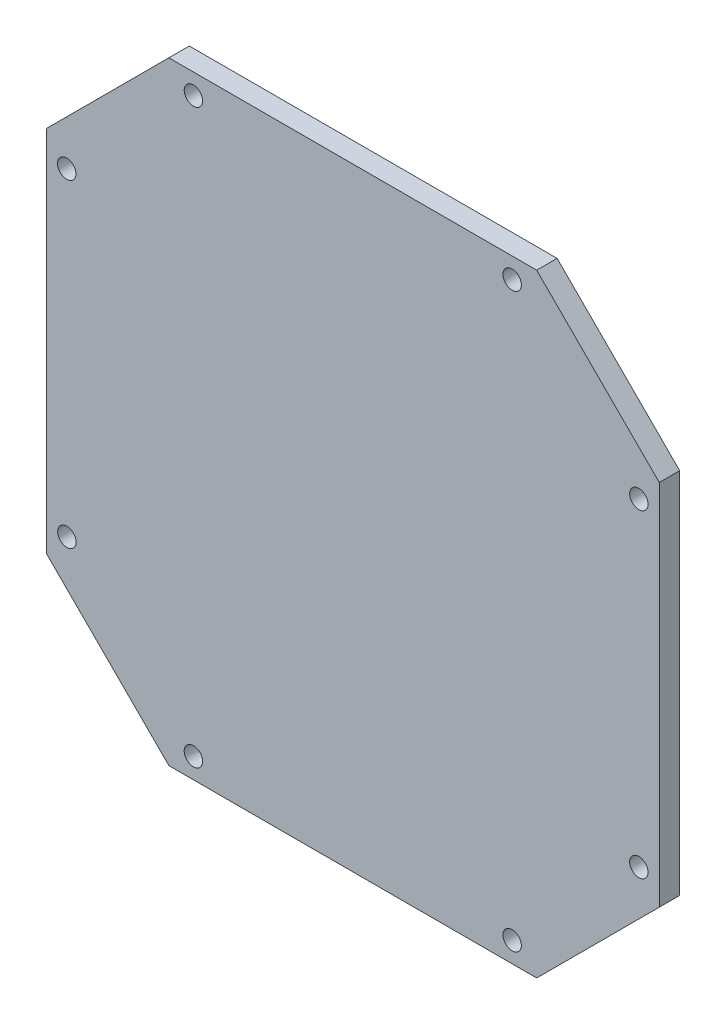
ISO-10303-21;
HEADER;
FILE_DESCRIPTION(('STEP AP214'),'2;1');
FILE_NAME('part.step','',(''),(''),'','','');
FILE_SCHEMA(('AUTOMOTIVE_DESIGN { 1 0 10303 214 1 1 1 1 }'));
ENDSEC;
DATA;
#1=APPLICATION_CONTEXT('core data for automotive mechanical design processes');
#2=APPLICATION_PROTOCOL_DEFINITION('international standard','automotive_design',2000,#1);
#3=PRODUCT_CONTEXT('',#1,'mechanical');
#4=PRODUCT('Part','Part','',(#3));
#5=PRODUCT_RELATED_PRODUCT_CATEGORY('part','',(#4));
#6=PRODUCT_DEFINITION_FORMATION('','',#4);
#7=PRODUCT_DEFINITION_CONTEXT('part definition',#1,'design');
#8=PRODUCT_DEFINITION('design','',#6,#7);
#9=PRODUCT_DEFINITION_SHAPE('','',#8);
#10=(LENGTH_UNIT() NAMED_UNIT(*) SI_UNIT(.MILLI.,.METRE.));
#11=(NAMED_UNIT(*) PLANE_ANGLE_UNIT() SI_UNIT($,.RADIAN.));
#12=(NAMED_UNIT(*) SI_UNIT($,.STERADIAN.) SOLID_ANGLE_UNIT());
#13=UNCERTAINTY_MEASURE_WITH_UNIT(LENGTH_MEASURE(1.E-05),#10,'distance_accuracy_value','');
#14=(GEOMETRIC_REPRESENTATION_CONTEXT(3) GLOBAL_UNCERTAINTY_ASSIGNED_CONTEXT((#13)) GLOBAL_UNIT_ASSIGNED_CONTEXT((#10,
#11,#12)) REPRESENTATION_CONTEXT('',''));
#15=CARTESIAN_POINT('',(0.,0.,0.));
#16=DIRECTION('',(0.,0.,1.));
#17=DIRECTION('',(1.,0.,0.));
#18=AXIS2_PLACEMENT_3D('',#15,#16,#17);
#19=CARTESIAN_POINT('',(60.,-60.0000000000002,10.));
#20=DIRECTION('',(0.707106781186549,0.707106781186547,0.));
#21=DIRECTION('',(-0.707106781186547,0.707106781186549,0.));
#22=AXIS2_PLACEMENT_3D('',#19,#20,#21);
#23=PLANE('',#22);
#24=DIRECTION('',(0.707106781186547,-0.707106781186549,0.));
#25=VECTOR('',#24,1.);
#26=CARTESIAN_POINT('',(60.,-60.0000000000002,0.));
#27=LINE('',#26,#25);
#28=CARTESIAN_POINT('',(0.,0.,0.));
#29=VERTEX_POINT('',#28);
#30=CARTESIAN_POINT('',(60.,-60.0000000000002,0.));
#31=VERTEX_POINT('',#30);
#32=EDGE_CURVE('E140',#29,#31,#27,.T.);
#33=ORIENTED_EDGE('',*,*,#32,.T.);
#34=DIRECTION('',(0.,0.,-1.));
#35=VECTOR('',#34,1.);
#36=CARTESIAN_POINT('',(60.,-60.0000000000002,10.));
#37=LINE('',#36,#35);
#38=CARTESIAN_POINT('',(60.,-60.0000000000002,10.));
#39=VERTEX_POINT('',#38);
#40=EDGE_CURVE('E11',#39,#31,#37,.T.);
#41=ORIENTED_EDGE('',*,*,#40,.F.);
#42=DIRECTION('',(0.707106781186547,-0.707106781186549,0.));
#43=VECTOR('',#42,1.);
#44=CARTESIAN_POINT('',(60.,-60.0000000000002,10.));
#45=LINE('',#44,#43);
#46=CARTESIAN_POINT('',(0.,0.,10.));
#47=VERTEX_POINT('',#46);
#48=EDGE_CURVE('E155',#47,#39,#45,.T.);
#49=ORIENTED_EDGE('',*,*,#48,.F.);
#50=DIRECTION('',(0.,0.,-1.));
#51=VECTOR('',#50,1.);
#52=CARTESIAN_POINT('',(0.,0.,10.));
#53=LINE('',#52,#51);
#54=EDGE_CURVE('E133',#47,#29,#53,.T.);
#55=ORIENTED_EDGE('',*,*,#54,.T.);
#56=EDGE_LOOP('',(#33,#41,#49,#55));
#57=FACE_BOUND('',#56,.T.);
#58=ADVANCED_FACE('F41',(#57),#23,.F.);
#59=CARTESIAN_POINT('',(240.,-60.0000000000001,10.));
#60=DIRECTION('',(0.,1.,0.));
#61=DIRECTION('',(-1.,0.,0.));
#62=AXIS2_PLACEMENT_3D('',#59,#60,#61);
#63=PLANE('',#62);
#64=DIRECTION('',(1.,0.,0.));
#65=VECTOR('',#64,1.);
#66=CARTESIAN_POINT('',(240.,-60.0000000000001,0.));
#67=LINE('',#66,#65);
#68=CARTESIAN_POINT('',(240.,-60.0000000000001,0.));
#69=VERTEX_POINT('',#68);
#70=EDGE_CURVE('E139',#31,#69,#67,.T.);
#71=ORIENTED_EDGE('',*,*,#70,.T.);
#72=DIRECTION('',(0.,0.,-1.));
#73=VECTOR('',#72,1.);
#74=CARTESIAN_POINT('',(240.,-60.0000000000001,10.));
#75=LINE('',#74,#73);
#76=CARTESIAN_POINT('',(240.,-60.0000000000001,10.));
#77=VERTEX_POINT('',#76);
#78=EDGE_CURVE('E47',#77,#69,#75,.T.);
#79=ORIENTED_EDGE('',*,*,#78,.F.);
#80=DIRECTION('',(1.,0.,0.));
#81=VECTOR('',#80,1.);
#82=CARTESIAN_POINT('',(240.,-60.0000000000001,10.));
#83=LINE('',#82,#81);
#84=EDGE_CURVE('E99',#39,#77,#83,.T.);
#85=ORIENTED_EDGE('',*,*,#84,.F.);
#86=ORIENTED_EDGE('',*,*,#40,.T.);
#87=EDGE_LOOP('',(#71,#79,#85,#86));
#88=FACE_BOUND('',#87,.T.);
#89=ADVANCED_FACE('F269',(#88),#63,.F.);
#90=CARTESIAN_POINT('',(300.,0.,10.));
#91=DIRECTION('',(-0.707106781186549,0.707106781186546,0.));
#92=DIRECTION('',(-0.707106781186546,-0.707106781186549,0.));
#93=AXIS2_PLACEMENT_3D('',#90,#91,#92);
#94=PLANE('',#93);
#95=DIRECTION('',(0.707106781186546,0.707106781186549,0.));
#96=VECTOR('',#95,1.);
#97=CARTESIAN_POINT('',(300.,0.,0.));
#98=LINE('',#97,#96);
#99=CARTESIAN_POINT('',(300.,0.,0.));
#100=VERTEX_POINT('',#99);
#101=EDGE_CURVE('E142',#69,#100,#98,.T.);
#102=ORIENTED_EDGE('',*,*,#101,.T.);
#103=DIRECTION('',(0.,0.,-1.));
#104=VECTOR('',#103,1.);
#105=CARTESIAN_POINT('',(300.,0.,10.));
#106=LINE('',#105,#104);
#107=CARTESIAN_POINT('',(300.,0.,10.));
#108=VERTEX_POINT('',#107);
#109=EDGE_CURVE('E159',#108,#100,#106,.T.);
#110=ORIENTED_EDGE('',*,*,#109,.F.);
#111=DIRECTION('',(0.707106781186546,0.707106781186549,0.));
#112=VECTOR('',#111,1.);
#113=CARTESIAN_POINT('',(300.,0.,10.));
#114=LINE('',#113,#112);
#115=EDGE_CURVE('E167',#77,#108,#114,.T.);
#116=ORIENTED_EDGE('',*,*,#115,.F.);
#117=ORIENTED_EDGE('',*,*,#78,.T.);
#118=EDGE_LOOP('',(#102,#110,#116,#117));
#119=FACE_BOUND('',#118,.T.);
#120=ADVANCED_FACE('F164',(#119),#94,.F.);
#121=CARTESIAN_POINT('',(300.,179.999999999999,10.));
#122=DIRECTION('',(-1.,0.,0.));
#123=DIRECTION('',(0.,-1.,0.));
#124=AXIS2_PLACEMENT_3D('',#121,#122,#123);
#125=PLANE('',#124);
#126=DIRECTION('',(0.,1.,0.));
#127=VECTOR('',#126,1.);
#128=CARTESIAN_POINT('',(300.,179.999999999999,0.));
#129=LINE('',#128,#127);
#130=CARTESIAN_POINT('',(300.,179.999999999999,0.));
#131=VERTEX_POINT('',#130);
#132=EDGE_CURVE('E144',#100,#131,#129,.T.);
#133=ORIENTED_EDGE('',*,*,#132,.T.);
#134=DIRECTION('',(0.,0.,-1.));
#135=VECTOR('',#134,1.);
#136=CARTESIAN_POINT('',(300.,179.999999999999,10.));
#137=LINE('',#136,#135);
#138=CARTESIAN_POINT('',(300.,179.999999999999,10.));
#139=VERTEX_POINT('',#138);
#140=EDGE_CURVE('E157',#139,#131,#137,.T.);
#141=ORIENTED_EDGE('',*,*,#140,.F.);
#142=DIRECTION('',(0.,1.,0.));
#143=VECTOR('',#142,1.);
#144=CARTESIAN_POINT('',(300.,179.999999999999,10.));
#145=LINE('',#144,#143);
#146=EDGE_CURVE('E177',#108,#139,#145,.T.);
#147=ORIENTED_EDGE('',*,*,#146,.F.);
#148=ORIENTED_EDGE('',*,*,#109,.T.);
#149=EDGE_LOOP('',(#133,#141,#147,#148));
#150=FACE_BOUND('',#149,.T.);
#151=ADVANCED_FACE('F172',(#150),#125,.F.);
#152=CARTESIAN_POINT('',(240.,240.,10.));
#153=DIRECTION('',(-0.707106781186551,-0.707106781186544,0.));
#154=DIRECTION('',(0.707106781186544,-0.707106781186551,0.));
#155=AXIS2_PLACEMENT_3D('',#152,#153,#154);
#156=PLANE('',#155);
#157=DIRECTION('',(-0.707106781186544,0.707106781186551,0.));
#158=VECTOR('',#157,1.);
#159=CARTESIAN_POINT('',(240.,240.,0.));
#160=LINE('',#159,#158);
#161=CARTESIAN_POINT('',(240.,240.,0.));
#162=VERTEX_POINT('',#161);
#163=EDGE_CURVE('E150',#131,#162,#160,.T.);
#164=ORIENTED_EDGE('',*,*,#163,.T.);
#165=DIRECTION('',(0.,0.,-1.));
#166=VECTOR('',#165,1.);
#167=CARTESIAN_POINT('',(240.,240.,10.));
#168=LINE('',#167,#166);
#169=CARTESIAN_POINT('',(240.,240.,10.));
#170=VERTEX_POINT('',#169);
#171=EDGE_CURVE('E126',#170,#162,#168,.T.);
#172=ORIENTED_EDGE('',*,*,#171,.F.);
#173=DIRECTION('',(-0.707106781186544,0.707106781186551,0.));
#174=VECTOR('',#173,1.);
#175=CARTESIAN_POINT('',(240.,240.,10.));
#176=LINE('',#175,#174);
#177=EDGE_CURVE('E117',#139,#170,#176,.T.);
#178=ORIENTED_EDGE('',*,*,#177,.F.);
#179=ORIENTED_EDGE('',*,*,#140,.T.);
#180=EDGE_LOOP('',(#164,#172,#178,#179));
#181=FACE_BOUND('',#180,.T.);
#182=ADVANCED_FACE('F178',(#181),#156,.F.);
#183=CARTESIAN_POINT('',(60.0000000000004,240.,10.));
#184=DIRECTION('',(0.,-1.,0.));
#185=DIRECTION('',(0.,0.,-1.));
#186=AXIS2_PLACEMENT_3D('',#183,#184,#185);
#187=PLANE('',#186);
#188=DIRECTION('',(-1.,0.,0.));
#189=VECTOR('',#188,1.);
#190=CARTESIAN_POINT('',(60.0000000000004,240.,0.));
#191=LINE('',#190,#189);
#192=CARTESIAN_POINT('',(60.0000000000004,240.,0.));
#193=VERTEX_POINT('',#192);
#194=EDGE_CURVE('E130',#162,#193,#191,.T.);
#195=ORIENTED_EDGE('',*,*,#194,.T.);
#196=DIRECTION('',(0.,0.,-1.));
#197=VECTOR('',#196,1.);
#198=CARTESIAN_POINT('',(60.0000000000004,240.,10.));
#199=LINE('',#198,#197);
#200=CARTESIAN_POINT('',(60.0000000000004,240.,10.));
#201=VERTEX_POINT('',#200);
#202=EDGE_CURVE('E125',#201,#193,#199,.T.);
#203=ORIENTED_EDGE('',*,*,#202,.F.);
#204=DIRECTION('',(-1.,0.,0.));
#205=VECTOR('',#204,1.);
#206=CARTESIAN_POINT('',(60.0000000000004,240.,10.));
#207=LINE('',#206,#205);
#208=EDGE_CURVE('E111',#170,#201,#207,.T.);
#209=ORIENTED_EDGE('',*,*,#208,.F.);
#210=ORIENTED_EDGE('',*,*,#171,.T.);
#211=EDGE_LOOP('',(#195,#203,#209,#210));
#212=FACE_BOUND('',#211,.T.);
#213=ADVANCED_FACE('F124',(#212),#187,.F.);
#214=CARTESIAN_POINT('',(0.,180.,10.));
#215=DIRECTION('',(0.707106781186544,-0.707106781186551,0.));
#216=DIRECTION('',(0.707106781186551,0.707106781186544,0.));
#217=AXIS2_PLACEMENT_3D('',#214,#215,#216);
#218=PLANE('',#217);
#219=DIRECTION('',(-0.707106781186551,-0.707106781186544,0.));
#220=VECTOR('',#219,1.);
#221=CARTESIAN_POINT('',(0.,180.,0.));
#222=LINE('',#221,#220);
#223=CARTESIAN_POINT('',(0.,180.,0.));
#224=VERTEX_POINT('',#223);
#225=EDGE_CURVE('E86',#193,#224,#222,.T.);
#226=ORIENTED_EDGE('',*,*,#225,.T.);
#227=DIRECTION('',(0.,0.,-1.));
#228=VECTOR('',#227,1.);
#229=CARTESIAN_POINT('',(0.,180.,10.));
#230=LINE('',#229,#228);
#231=CARTESIAN_POINT('',(0.,180.,10.));
#232=VERTEX_POINT('',#231);
#233=EDGE_CURVE('E129',#232,#224,#230,.T.);
#234=ORIENTED_EDGE('',*,*,#233,.F.);
#235=DIRECTION('',(-0.707106781186551,-0.707106781186544,0.));
#236=VECTOR('',#235,1.);
#237=CARTESIAN_POINT('',(0.,180.,10.));
#238=LINE('',#237,#236);
#239=EDGE_CURVE('E120',#201,#232,#238,.T.);
#240=ORIENTED_EDGE('',*,*,#239,.F.);
#241=ORIENTED_EDGE('',*,*,#202,.T.);
#242=EDGE_LOOP('',(#226,#234,#240,#241));
#243=FACE_BOUND('',#242,.T.);
#244=ADVANCED_FACE('F131',(#243),#218,.F.);
#245=CARTESIAN_POINT('',(0.,0.,10.));
#246=DIRECTION('',(1.,0.,0.));
#247=DIRECTION('',(0.,0.,-1.));
#248=AXIS2_PLACEMENT_3D('',#245,#246,#247);
#249=PLANE('',#248);
#250=DIRECTION('',(0.,-1.,0.));
#251=VECTOR('',#250,1.);
#252=CARTESIAN_POINT('',(0.,0.,0.));
#253=LINE('',#252,#251);
#254=EDGE_CURVE('E95',#224,#29,#253,.T.);
#255=ORIENTED_EDGE('',*,*,#254,.T.);
#256=ORIENTED_EDGE('',*,*,#54,.F.);
#257=DIRECTION('',(0.,-1.,0.));
#258=VECTOR('',#257,1.);
#259=CARTESIAN_POINT('',(0.,0.,10.));
#260=LINE('',#259,#258);
#261=EDGE_CURVE('E60',#232,#47,#260,.T.);
#262=ORIENTED_EDGE('',*,*,#261,.F.);
#263=ORIENTED_EDGE('',*,*,#233,.T.);
#264=EDGE_LOOP('',(#255,#256,#262,#263));
#265=FACE_BOUND('',#264,.T.);
#266=ADVANCED_FACE('F263',(#265),#249,.F.);
#267=CARTESIAN_POINT('',(0.,0.,10.));
#268=DIRECTION('',(0.,0.,-1.));
#269=DIRECTION('',(-1.,0.,0.));
#270=AXIS2_PLACEMENT_3D('',#267,#268,#269);
#271=PLANE('',#270);
#272=CARTESIAN_POINT('',(72.,230.,10.));
#273=DIRECTION('',(0.,0.,-1.));
#274=DIRECTION('',(-1.,0.,0.));
#275=AXIS2_PLACEMENT_3D('',#272,#273,#274);
#276=CIRCLE('',#275,4.5);
#277=CARTESIAN_POINT('',(67.5,230.,10.));
#278=VERTEX_POINT('',#277);
#279=EDGE_CURVE('E226',#278,#278,#276,.T.);
#280=ORIENTED_EDGE('',*,*,#279,.T.);
#281=EDGE_LOOP('',(#280));
#282=FACE_BOUND('',#281,.T.);
#283=CARTESIAN_POINT('',(228.,230.,10.));
#284=DIRECTION('',(0.,0.,-1.));
#285=DIRECTION('',(-1.,0.,0.));
#286=AXIS2_PLACEMENT_3D('',#283,#284,#285);
#287=CIRCLE('',#286,4.5);
#288=CARTESIAN_POINT('',(223.5,230.,10.));
#289=VERTEX_POINT('',#288);
#290=EDGE_CURVE('E217',#289,#289,#287,.T.);
#291=ORIENTED_EDGE('',*,*,#290,.T.);
#292=EDGE_LOOP('',(#291));
#293=FACE_BOUND('',#292,.T.);
#294=CARTESIAN_POINT('',(290.,168.,10.));
#295=DIRECTION('',(0.,0.,-1.));
#296=DIRECTION('',(-1.,0.,0.));
#297=AXIS2_PLACEMENT_3D('',#294,#295,#296);
#298=CIRCLE('',#297,4.5);
#299=CARTESIAN_POINT('',(285.5,168.,10.));
#300=VERTEX_POINT('',#299);
#301=EDGE_CURVE('E215',#300,#300,#298,.T.);
#302=ORIENTED_EDGE('',*,*,#301,.T.);
#303=EDGE_LOOP('',(#302));
#304=FACE_BOUND('',#303,.T.);
#305=CARTESIAN_POINT('',(290.,11.9999999999998,10.));
#306=DIRECTION('',(0.,0.,-1.));
#307=DIRECTION('',(-1.,0.,0.));
#308=AXIS2_PLACEMENT_3D('',#305,#306,#307);
#309=CIRCLE('',#308,4.5);
#310=CARTESIAN_POINT('',(285.5,11.9999999999998,10.));
#311=VERTEX_POINT('',#310);
#312=EDGE_CURVE('E206',#311,#311,#309,.T.);
#313=ORIENTED_EDGE('',*,*,#312,.T.);
#314=EDGE_LOOP('',(#313));
#315=FACE_BOUND('',#314,.T.);
#316=CARTESIAN_POINT('',(228.,-50.0000000000002,10.));
#317=DIRECTION('',(0.,0.,-1.));
#318=DIRECTION('',(-1.,0.,0.));
#319=AXIS2_PLACEMENT_3D('',#316,#317,#318);
#320=CIRCLE('',#319,4.5);
#321=CARTESIAN_POINT('',(223.5,-50.0000000000002,10.));
#322=VERTEX_POINT('',#321);
#323=EDGE_CURVE('E205',#322,#322,#320,.T.);
#324=ORIENTED_EDGE('',*,*,#323,.T.);
#325=EDGE_LOOP('',(#324));
#326=FACE_BOUND('',#325,.T.);
#327=CARTESIAN_POINT('',(72.,-50.0000000000002,10.));
#328=DIRECTION('',(0.,0.,-1.));
#329=DIRECTION('',(-1.,0.,0.));
#330=AXIS2_PLACEMENT_3D('',#327,#328,#329);
#331=CIRCLE('',#330,4.5);
#332=CARTESIAN_POINT('',(67.5,-50.0000000000002,10.));
#333=VERTEX_POINT('',#332);
#334=EDGE_CURVE('E198',#333,#333,#331,.T.);
#335=ORIENTED_EDGE('',*,*,#334,.T.);
#336=EDGE_LOOP('',(#335));
#337=FACE_BOUND('',#336,.T.);
#338=CARTESIAN_POINT('',(10.0957252695612,11.9999999999998,10.));
#339=DIRECTION('',(0.,0.,-1.));
#340=DIRECTION('',(-1.,0.,0.));
#341=AXIS2_PLACEMENT_3D('',#338,#339,#340);
#342=CIRCLE('',#341,4.5);
#343=CARTESIAN_POINT('',(5.59572526956121,11.9999999999998,10.));
#344=VERTEX_POINT('',#343);
#345=EDGE_CURVE('E189',#344,#344,#342,.T.);
#346=ORIENTED_EDGE('',*,*,#345,.T.);
#347=EDGE_LOOP('',(#346));
#348=FACE_BOUND('',#347,.T.);
#349=CARTESIAN_POINT('',(10.,168.,10.));
#350=DIRECTION('',(0.,0.,-1.));
#351=DIRECTION('',(-1.,0.,0.));
#352=AXIS2_PLACEMENT_3D('',#349,#350,#351);
#353=CIRCLE('',#352,4.5);
#354=CARTESIAN_POINT('',(5.50000000000001,168.,10.));
#355=VERTEX_POINT('',#354);
#356=EDGE_CURVE('E141',#355,#355,#353,.T.);
#357=ORIENTED_EDGE('',*,*,#356,.T.);
#358=EDGE_LOOP('',(#357));
#359=FACE_BOUND('',#358,.T.);
#360=ORIENTED_EDGE('',*,*,#48,.T.);
#361=ORIENTED_EDGE('',*,*,#84,.T.);
#362=ORIENTED_EDGE('',*,*,#115,.T.);
#363=ORIENTED_EDGE('',*,*,#146,.T.);
#364=ORIENTED_EDGE('',*,*,#177,.T.);
#365=ORIENTED_EDGE('',*,*,#208,.T.);
#366=ORIENTED_EDGE('',*,*,#239,.T.);
#367=ORIENTED_EDGE('',*,*,#261,.T.);
#368=EDGE_LOOP('',(#360,#361,#362,#363,#364,#365,#366,#367));
#369=FACE_BOUND('',#368,.T.);
#370=ADVANCED_FACE('F113',(#282,#293,#304,#315,#326,#337,#348,#359,#369),#271,.F.);
#371=CARTESIAN_POINT('',(0.,0.,0.));
#372=DIRECTION('',(0.,0.,-1.));
#373=DIRECTION('',(-1.,0.,0.));
#374=AXIS2_PLACEMENT_3D('',#371,#372,#373);
#375=PLANE('',#374);
#376=CARTESIAN_POINT('',(72.,230.,0.));
#377=DIRECTION('',(0.,0.,-1.));
#378=DIRECTION('',(-1.,0.,0.));
#379=AXIS2_PLACEMENT_3D('',#376,#377,#378);
#380=CIRCLE('',#379,4.5);
#381=CARTESIAN_POINT('',(67.5,230.,0.));
#382=VERTEX_POINT('',#381);
#383=EDGE_CURVE('E227',#382,#382,#380,.T.);
#384=ORIENTED_EDGE('',*,*,#383,.F.);
#385=EDGE_LOOP('',(#384));
#386=FACE_BOUND('',#385,.T.);
#387=CARTESIAN_POINT('',(228.,230.,0.));
#388=DIRECTION('',(0.,0.,-1.));
#389=DIRECTION('',(-1.,0.,0.));
#390=AXIS2_PLACEMENT_3D('',#387,#388,#389);
#391=CIRCLE('',#390,4.5);
#392=CARTESIAN_POINT('',(223.5,230.,0.));
#393=VERTEX_POINT('',#392);
#394=EDGE_CURVE('E223',#393,#393,#391,.T.);
#395=ORIENTED_EDGE('',*,*,#394,.F.);
#396=EDGE_LOOP('',(#395));
#397=FACE_BOUND('',#396,.T.);
#398=CARTESIAN_POINT('',(290.,168.,0.));
#399=DIRECTION('',(0.,0.,-1.));
#400=DIRECTION('',(-1.,0.,0.));
#401=AXIS2_PLACEMENT_3D('',#398,#399,#400);
#402=CIRCLE('',#401,4.5);
#403=CARTESIAN_POINT('',(285.5,168.,0.));
#404=VERTEX_POINT('',#403);
#405=EDGE_CURVE('E220',#404,#404,#402,.T.);
#406=ORIENTED_EDGE('',*,*,#405,.F.);
#407=EDGE_LOOP('',(#406));
#408=FACE_BOUND('',#407,.T.);
#409=CARTESIAN_POINT('',(290.,11.9999999999998,0.));
#410=DIRECTION('',(0.,0.,-1.));
#411=DIRECTION('',(-1.,0.,0.));
#412=AXIS2_PLACEMENT_3D('',#409,#410,#411);
#413=CIRCLE('',#412,4.5);
#414=CARTESIAN_POINT('',(285.5,11.9999999999998,0.));
#415=VERTEX_POINT('',#414);
#416=EDGE_CURVE('E213',#415,#415,#413,.T.);
#417=ORIENTED_EDGE('',*,*,#416,.F.);
#418=EDGE_LOOP('',(#417));
#419=FACE_BOUND('',#418,.T.);
#420=CARTESIAN_POINT('',(228.,-50.0000000000002,0.));
#421=DIRECTION('',(0.,0.,-1.));
#422=DIRECTION('',(-1.,0.,0.));
#423=AXIS2_PLACEMENT_3D('',#420,#421,#422);
#424=CIRCLE('',#423,4.5);
#425=CARTESIAN_POINT('',(223.5,-50.0000000000002,0.));
#426=VERTEX_POINT('',#425);
#427=EDGE_CURVE('E203',#426,#426,#424,.T.);
#428=ORIENTED_EDGE('',*,*,#427,.F.);
#429=EDGE_LOOP('',(#428));
#430=FACE_BOUND('',#429,.T.);
#431=CARTESIAN_POINT('',(72.,-50.0000000000002,0.));
#432=DIRECTION('',(0.,0.,-1.));
#433=DIRECTION('',(-1.,0.,0.));
#434=AXIS2_PLACEMENT_3D('',#431,#432,#433);
#435=CIRCLE('',#434,4.5);
#436=CARTESIAN_POINT('',(67.5,-50.0000000000002,0.));
#437=VERTEX_POINT('',#436);
#438=EDGE_CURVE('E197',#437,#437,#435,.T.);
#439=ORIENTED_EDGE('',*,*,#438,.F.);
#440=EDGE_LOOP('',(#439));
#441=FACE_BOUND('',#440,.T.);
#442=CARTESIAN_POINT('',(10.0957252695612,11.9999999999998,0.));
#443=DIRECTION('',(0.,0.,-1.));
#444=DIRECTION('',(-1.,0.,0.));
#445=AXIS2_PLACEMENT_3D('',#442,#443,#444);
#446=CIRCLE('',#445,4.5);
#447=CARTESIAN_POINT('',(5.59572526956121,11.9999999999998,0.));
#448=VERTEX_POINT('',#447);
#449=EDGE_CURVE('E194',#448,#448,#446,.T.);
#450=ORIENTED_EDGE('',*,*,#449,.F.);
#451=EDGE_LOOP('',(#450));
#452=FACE_BOUND('',#451,.T.);
#453=CARTESIAN_POINT('',(10.,168.,0.));
#454=DIRECTION('',(0.,0.,-1.));
#455=DIRECTION('',(-1.,0.,0.));
#456=AXIS2_PLACEMENT_3D('',#453,#454,#455);
#457=CIRCLE('',#456,4.5);
#458=CARTESIAN_POINT('',(5.50000000000001,168.,0.));
#459=VERTEX_POINT('',#458);
#460=EDGE_CURVE('E190',#459,#459,#457,.T.);
#461=ORIENTED_EDGE('',*,*,#460,.F.);
#462=EDGE_LOOP('',(#461));
#463=FACE_BOUND('',#462,.T.);
#464=ORIENTED_EDGE('',*,*,#32,.F.);
#465=ORIENTED_EDGE('',*,*,#254,.F.);
#466=ORIENTED_EDGE('',*,*,#225,.F.);
#467=ORIENTED_EDGE('',*,*,#194,.F.);
#468=ORIENTED_EDGE('',*,*,#163,.F.);
#469=ORIENTED_EDGE('',*,*,#132,.F.);
#470=ORIENTED_EDGE('',*,*,#101,.F.);
#471=ORIENTED_EDGE('',*,*,#70,.F.);
#472=EDGE_LOOP('',(#464,#465,#466,#467,#468,#469,#470,#471));
#473=FACE_BOUND('',#472,.T.);
#474=ADVANCED_FACE('F173',(#386,#397,#408,#419,#430,#441,#452,#463,#473),#375,.T.);
#475=CARTESIAN_POINT('',(10.,168.,0.));
#476=DIRECTION('',(0.,0.,-1.));
#477=DIRECTION('',(-1.,0.,0.));
#478=AXIS2_PLACEMENT_3D('',#475,#476,#477);
#479=CYLINDRICAL_SURFACE('',#478,4.5);
#480=ORIENTED_EDGE('',*,*,#460,.T.);
#481=EDGE_LOOP('',(#480));
#482=FACE_BOUND('',#481,.T.);
#483=ORIENTED_EDGE('',*,*,#356,.F.);
#484=EDGE_LOOP('',(#483));
#485=FACE_BOUND('',#484,.T.);
#486=ADVANCED_FACE('F239',(#482,#485),#479,.F.);
#487=CARTESIAN_POINT('',(10.0957252695612,11.9999999999998,0.));
#488=DIRECTION('',(0.,0.,-1.));
#489=DIRECTION('',(-1.,0.,0.));
#490=AXIS2_PLACEMENT_3D('',#487,#488,#489);
#491=CYLINDRICAL_SURFACE('',#490,4.5);
#492=ORIENTED_EDGE('',*,*,#449,.T.);
#493=EDGE_LOOP('',(#492));
#494=FACE_BOUND('',#493,.T.);
#495=ORIENTED_EDGE('',*,*,#345,.F.);
#496=EDGE_LOOP('',(#495));
#497=FACE_BOUND('',#496,.T.);
#498=ADVANCED_FACE('F258',(#494,#497),#491,.F.);
#499=CARTESIAN_POINT('',(72.,-50.0000000000002,0.));
#500=DIRECTION('',(0.,0.,-1.));
#501=DIRECTION('',(-1.,0.,0.));
#502=AXIS2_PLACEMENT_3D('',#499,#500,#501);
#503=CYLINDRICAL_SURFACE('',#502,4.5);
#504=ORIENTED_EDGE('',*,*,#438,.T.);
#505=EDGE_LOOP('',(#504));
#506=FACE_BOUND('',#505,.T.);
#507=ORIENTED_EDGE('',*,*,#334,.F.);
#508=EDGE_LOOP('',(#507));
#509=FACE_BOUND('',#508,.T.);
#510=ADVANCED_FACE('F323',(#506,#509),#503,.F.);
#511=CARTESIAN_POINT('',(228.,-50.0000000000002,0.));
#512=DIRECTION('',(0.,0.,-1.));
#513=DIRECTION('',(-1.,0.,0.));
#514=AXIS2_PLACEMENT_3D('',#511,#512,#513);
#515=CYLINDRICAL_SURFACE('',#514,4.5);
#516=ORIENTED_EDGE('',*,*,#427,.T.);
#517=EDGE_LOOP('',(#516));
#518=FACE_BOUND('',#517,.T.);
#519=ORIENTED_EDGE('',*,*,#323,.F.);
#520=EDGE_LOOP('',(#519));
#521=FACE_BOUND('',#520,.T.);
#522=ADVANCED_FACE('F332',(#518,#521),#515,.F.);
#523=CARTESIAN_POINT('',(290.,11.9999999999998,0.));
#524=DIRECTION('',(0.,0.,-1.));
#525=DIRECTION('',(-1.,0.,0.));
#526=AXIS2_PLACEMENT_3D('',#523,#524,#525);
#527=CYLINDRICAL_SURFACE('',#526,4.5);
#528=ORIENTED_EDGE('',*,*,#416,.T.);
#529=EDGE_LOOP('',(#528));
#530=FACE_BOUND('',#529,.T.);
#531=ORIENTED_EDGE('',*,*,#312,.F.);
#532=EDGE_LOOP('',(#531));
#533=FACE_BOUND('',#532,.T.);
#534=ADVANCED_FACE('F342',(#530,#533),#527,.F.);
#535=CARTESIAN_POINT('',(290.,168.,0.));
#536=DIRECTION('',(0.,0.,-1.));
#537=DIRECTION('',(-1.,0.,0.));
#538=AXIS2_PLACEMENT_3D('',#535,#536,#537);
#539=CYLINDRICAL_SURFACE('',#538,4.5);
#540=ORIENTED_EDGE('',*,*,#405,.T.);
#541=EDGE_LOOP('',(#540));
#542=FACE_BOUND('',#541,.T.);
#543=ORIENTED_EDGE('',*,*,#301,.F.);
#544=EDGE_LOOP('',(#543));
#545=FACE_BOUND('',#544,.T.);
#546=ADVANCED_FACE('F354',(#542,#545),#539,.F.);
#547=CARTESIAN_POINT('',(228.,230.,0.));
#548=DIRECTION('',(0.,0.,-1.));
#549=DIRECTION('',(-1.,0.,0.));
#550=AXIS2_PLACEMENT_3D('',#547,#548,#549);
#551=CYLINDRICAL_SURFACE('',#550,4.5);
#552=ORIENTED_EDGE('',*,*,#394,.T.);
#553=EDGE_LOOP('',(#552));
#554=FACE_BOUND('',#553,.T.);
#555=ORIENTED_EDGE('',*,*,#290,.F.);
#556=EDGE_LOOP('',(#555));
#557=FACE_BOUND('',#556,.T.);
#558=ADVANCED_FACE('F362',(#554,#557),#551,.F.);
#559=CARTESIAN_POINT('',(72.,230.,0.));
#560=DIRECTION('',(0.,0.,-1.));
#561=DIRECTION('',(-1.,0.,0.));
#562=AXIS2_PLACEMENT_3D('',#559,#560,#561);
#563=CYLINDRICAL_SURFACE('',#562,4.5);
#564=ORIENTED_EDGE('',*,*,#383,.T.);
#565=EDGE_LOOP('',(#564));
#566=FACE_BOUND('',#565,.T.);
#567=ORIENTED_EDGE('',*,*,#279,.F.);
#568=EDGE_LOOP('',(#567));
#569=FACE_BOUND('',#568,.T.);
#570=ADVANCED_FACE('F232',(#566,#569),#563,.F.);
#571=CLOSED_SHELL('',(#58,#89,#120,#151,#182,#213,#244,#266,#370,#474,#486,#498,#510,#522,#534,
#546,#558,#570));
#572=MANIFOLD_SOLID_BREP('B2',#571);
#573=ADVANCED_BREP_SHAPE_REPRESENTATION('',(#18,#572),#14);
#574=SHAPE_DEFINITION_REPRESENTATION(#9,#573);
ENDSEC;
END-ISO-10303-21;
